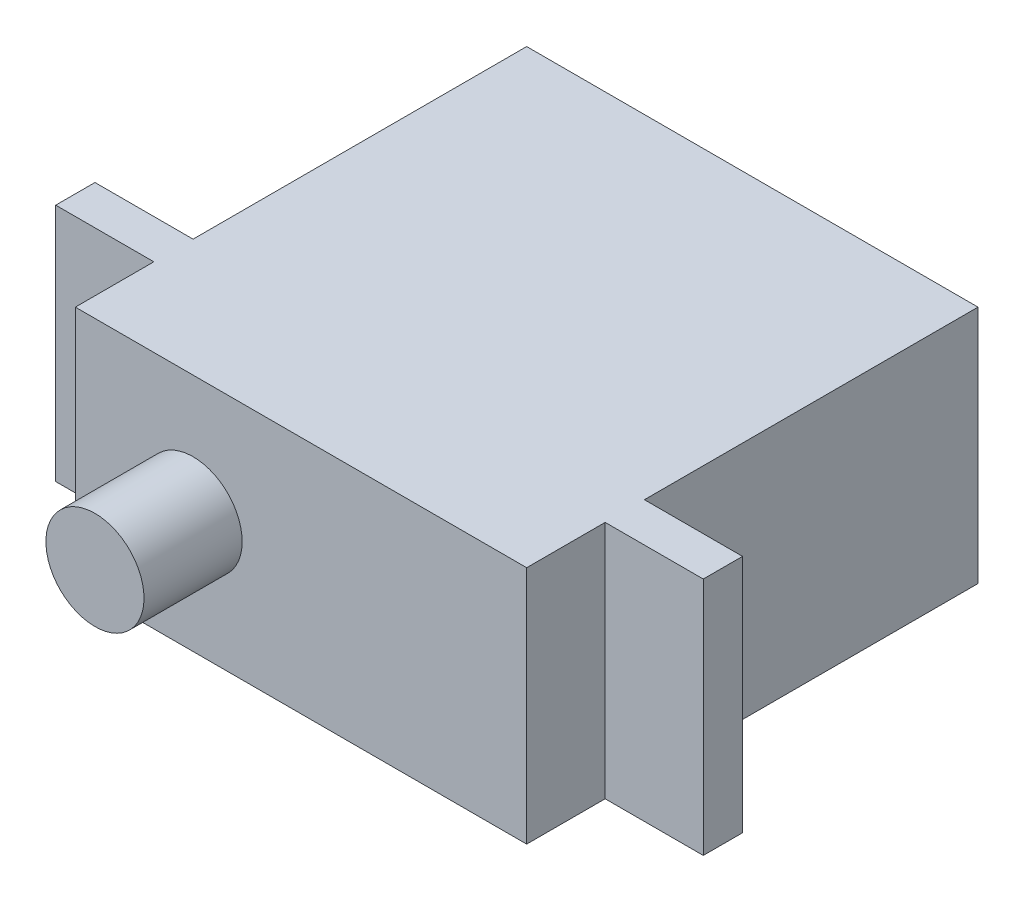
ISO-10303-21;
HEADER;
FILE_DESCRIPTION(('STEP AP214'),'2;1');
FILE_NAME('part.step','',(''),(''),'','','');
FILE_SCHEMA(('AUTOMOTIVE_DESIGN { 1 0 10303 214 1 1 1 1 }'));
ENDSEC;
DATA;
#1=APPLICATION_CONTEXT('core data for automotive mechanical design processes');
#2=APPLICATION_PROTOCOL_DEFINITION('international standard','automotive_design',2000,#1);
#3=PRODUCT_CONTEXT('',#1,'mechanical');
#4=PRODUCT('Part','Part','',(#3));
#5=PRODUCT_RELATED_PRODUCT_CATEGORY('part','',(#4));
#6=PRODUCT_DEFINITION_FORMATION('','',#4);
#7=PRODUCT_DEFINITION_CONTEXT('part definition',#1,'design');
#8=PRODUCT_DEFINITION('design','',#6,#7);
#9=PRODUCT_DEFINITION_SHAPE('','',#8);
#10=(LENGTH_UNIT() NAMED_UNIT(*) SI_UNIT(.MILLI.,.METRE.));
#11=(NAMED_UNIT(*) PLANE_ANGLE_UNIT() SI_UNIT($,.RADIAN.));
#12=(NAMED_UNIT(*) SI_UNIT($,.STERADIAN.) SOLID_ANGLE_UNIT());
#13=UNCERTAINTY_MEASURE_WITH_UNIT(LENGTH_MEASURE(1.E-05),#10,'distance_accuracy_value','');
#14=(GEOMETRIC_REPRESENTATION_CONTEXT(3) GLOBAL_UNCERTAINTY_ASSIGNED_CONTEXT((#13)) GLOBAL_UNIT_ASSIGNED_CONTEXT((#10,
#11,#12)) REPRESENTATION_CONTEXT('',''));
#15=CARTESIAN_POINT('',(0.,0.,0.));
#16=DIRECTION('',(0.,0.,1.));
#17=DIRECTION('',(1.,0.,0.));
#18=AXIS2_PLACEMENT_3D('',#15,#16,#17);
#19=CARTESIAN_POINT('',(-6.,-6.1,4.));
#20=DIRECTION('',(1.,0.,0.));
#21=DIRECTION('',(0.,0.,-1.));
#22=AXIS2_PLACEMENT_3D('',#19,#20,#21);
#23=PLANE('',#22);
#24=DIRECTION('',(0.,1.,0.));
#25=VECTOR('',#24,1.);
#26=CARTESIAN_POINT('',(-6.,-6.1,0.));
#27=LINE('',#26,#25);
#28=CARTESIAN_POINT('',(-6.,-6.1,0.));
#29=VERTEX_POINT('',#28);
#30=CARTESIAN_POINT('',(-6.,6.1,0.));
#31=VERTEX_POINT('',#30);
#32=EDGE_CURVE('E165',#29,#31,#27,.T.);
#33=ORIENTED_EDGE('',*,*,#32,.F.);
#34=DIRECTION('',(0.,0.,-1.));
#35=VECTOR('',#34,1.);
#36=CARTESIAN_POINT('',(-6.,-6.1,4.));
#37=LINE('',#36,#35);
#38=CARTESIAN_POINT('',(-6.,-6.1,4.));
#39=VERTEX_POINT('',#38);
#40=EDGE_CURVE('E143',#39,#29,#37,.T.);
#41=ORIENTED_EDGE('',*,*,#40,.F.);
#42=DIRECTION('',(0.,-1.,0.));
#43=VECTOR('',#42,1.);
#44=CARTESIAN_POINT('',(-6.,-6.1,4.));
#45=LINE('',#44,#43);
#46=CARTESIAN_POINT('',(-6.,6.1,4.));
#47=VERTEX_POINT('',#46);
#48=EDGE_CURVE('E172',#47,#39,#45,.T.);
#49=ORIENTED_EDGE('',*,*,#48,.F.);
#50=DIRECTION('',(0.,0.,-1.));
#51=VECTOR('',#50,1.);
#52=CARTESIAN_POINT('',(-6.,6.1,4.));
#53=LINE('',#52,#51);
#54=EDGE_CURVE('E195',#47,#31,#53,.T.);
#55=ORIENTED_EDGE('',*,*,#54,.T.);
#56=EDGE_LOOP('',(#33,#41,#49,#55));
#57=FACE_BOUND('',#56,.T.);
#58=ADVANCED_FACE('F43',(#57),#23,.F.);
#59=CARTESIAN_POINT('',(17.,-6.1,4.));
#60=DIRECTION('',(-1.,0.,0.));
#61=DIRECTION('',(0.,0.,1.));
#62=AXIS2_PLACEMENT_3D('',#59,#60,#61);
#63=PLANE('',#62);
#64=DIRECTION('',(0.,-1.,0.));
#65=VECTOR('',#64,1.);
#66=CARTESIAN_POINT('',(17.,-6.1,0.));
#67=LINE('',#66,#65);
#68=CARTESIAN_POINT('',(17.,6.1,0.));
#69=VERTEX_POINT('',#68);
#70=CARTESIAN_POINT('',(17.,-6.1,0.));
#71=VERTEX_POINT('',#70);
#72=EDGE_CURVE('E50',#69,#71,#67,.T.);
#73=ORIENTED_EDGE('',*,*,#72,.F.);
#74=DIRECTION('',(0.,0.,-1.));
#75=VECTOR('',#74,1.);
#76=CARTESIAN_POINT('',(17.,6.1,4.));
#77=LINE('',#76,#75);
#78=CARTESIAN_POINT('',(17.,6.1,4.));
#79=VERTEX_POINT('',#78);
#80=EDGE_CURVE('E198',#79,#69,#77,.T.);
#81=ORIENTED_EDGE('',*,*,#80,.F.);
#82=DIRECTION('',(0.,1.,0.));
#83=VECTOR('',#82,1.);
#84=CARTESIAN_POINT('',(17.,-6.1,4.));
#85=LINE('',#84,#83);
#86=CARTESIAN_POINT('',(17.,-6.1,4.));
#87=VERTEX_POINT('',#86);
#88=EDGE_CURVE('E179',#87,#79,#85,.T.);
#89=ORIENTED_EDGE('',*,*,#88,.F.);
#90=DIRECTION('',(0.,0.,-1.));
#91=VECTOR('',#90,1.);
#92=CARTESIAN_POINT('',(17.,-6.1,4.));
#93=LINE('',#92,#91);
#94=EDGE_CURVE('E199',#87,#71,#93,.T.);
#95=ORIENTED_EDGE('',*,*,#94,.T.);
#96=EDGE_LOOP('',(#73,#81,#89,#95));
#97=FACE_BOUND('',#96,.T.);
#98=ADVANCED_FACE('F219',(#97),#63,.F.);
#99=CARTESIAN_POINT('',(-6.,-6.1,-2.));
#100=VERTEX_POINT('',#99);
#101=CARTESIAN_POINT('',(-6.,-6.1,-19.));
#102=VERTEX_POINT('',#101);
#103=EDGE_CURVE('E201',#100,#102,#37,.T.);
#104=ORIENTED_EDGE('',*,*,#103,.F.);
#105=DIRECTION('',(0.,1.,0.));
#106=VECTOR('',#105,1.);
#107=CARTESIAN_POINT('',(-6.,-6.1,-2.));
#108=LINE('',#107,#106);
#109=CARTESIAN_POINT('',(-6.,6.1,-2.));
#110=VERTEX_POINT('',#109);
#111=EDGE_CURVE('E157',#100,#110,#108,.T.);
#112=ORIENTED_EDGE('',*,*,#111,.T.);
#113=CARTESIAN_POINT('',(-6.,6.1,-19.));
#114=VERTEX_POINT('',#113);
#115=EDGE_CURVE('E182',#110,#114,#53,.T.);
#116=ORIENTED_EDGE('',*,*,#115,.T.);
#117=DIRECTION('',(0.,-1.,0.));
#118=VECTOR('',#117,1.);
#119=CARTESIAN_POINT('',(-6.,-6.1,-19.));
#120=LINE('',#119,#118);
#121=EDGE_CURVE('E168',#114,#102,#120,.T.);
#122=ORIENTED_EDGE('',*,*,#121,.T.);
#123=EDGE_LOOP('',(#104,#112,#116,#122));
#124=FACE_BOUND('',#123,.T.);
#125=ADVANCED_FACE('F44',(#124),#23,.F.);
#126=CARTESIAN_POINT('',(-6.,-6.1,4.));
#127=DIRECTION('',(0.,1.,0.));
#128=DIRECTION('',(0.,0.,1.));
#129=AXIS2_PLACEMENT_3D('',#126,#127,#128);
#130=PLANE('',#129);
#131=ORIENTED_EDGE('',*,*,#40,.T.);
#132=DIRECTION('',(1.,0.,0.));
#133=VECTOR('',#132,1.);
#134=CARTESIAN_POINT('',(-11.,-6.1,0.));
#135=LINE('',#134,#133);
#136=CARTESIAN_POINT('',(-11.,-6.1,0.));
#137=VERTEX_POINT('',#136);
#138=EDGE_CURVE('E134',#137,#29,#135,.T.);
#139=ORIENTED_EDGE('',*,*,#138,.F.);
#140=DIRECTION('',(0.,0.,-1.));
#141=VECTOR('',#140,1.);
#142=CARTESIAN_POINT('',(-11.,-6.1,0.));
#143=LINE('',#142,#141);
#144=CARTESIAN_POINT('',(-11.,-6.1,-2.));
#145=VERTEX_POINT('',#144);
#146=EDGE_CURVE('E139',#137,#145,#143,.T.);
#147=ORIENTED_EDGE('',*,*,#146,.T.);
#148=DIRECTION('',(1.,0.,0.));
#149=VECTOR('',#148,1.);
#150=CARTESIAN_POINT('',(-11.,-6.1,-2.));
#151=LINE('',#150,#149);
#152=EDGE_CURVE('E231',#145,#100,#151,.T.);
#153=ORIENTED_EDGE('',*,*,#152,.T.);
#154=ORIENTED_EDGE('',*,*,#103,.T.);
#155=DIRECTION('',(1.,0.,0.));
#156=VECTOR('',#155,1.);
#157=CARTESIAN_POINT('',(-6.,-6.1,-19.));
#158=LINE('',#157,#156);
#159=CARTESIAN_POINT('',(17.,-6.1,-19.));
#160=VERTEX_POINT('',#159);
#161=EDGE_CURVE('E184',#102,#160,#158,.T.);
#162=ORIENTED_EDGE('',*,*,#161,.T.);
#163=CARTESIAN_POINT('',(17.,-6.1,-2.));
#164=VERTEX_POINT('',#163);
#165=EDGE_CURVE('E200',#164,#160,#93,.T.);
#166=ORIENTED_EDGE('',*,*,#165,.F.);
#167=CARTESIAN_POINT('',(22.,-6.1,-2.));
#168=VERTEX_POINT('',#167);
#169=EDGE_CURVE('E69',#164,#168,#151,.T.);
#170=ORIENTED_EDGE('',*,*,#169,.T.);
#171=DIRECTION('',(0.,0.,-1.));
#172=VECTOR('',#171,1.);
#173=CARTESIAN_POINT('',(22.,-6.1,0.));
#174=LINE('',#173,#172);
#175=CARTESIAN_POINT('',(22.,-6.1,0.));
#176=VERTEX_POINT('',#175);
#177=EDGE_CURVE('E159',#176,#168,#174,.T.);
#178=ORIENTED_EDGE('',*,*,#177,.F.);
#179=EDGE_CURVE('E144',#71,#176,#135,.T.);
#180=ORIENTED_EDGE('',*,*,#179,.F.);
#181=ORIENTED_EDGE('',*,*,#94,.F.);
#182=DIRECTION('',(1.,0.,0.));
#183=VECTOR('',#182,1.);
#184=CARTESIAN_POINT('',(-6.,-6.1,4.));
#185=LINE('',#184,#183);
#186=EDGE_CURVE('E171',#39,#87,#185,.T.);
#187=ORIENTED_EDGE('',*,*,#186,.F.);
#188=EDGE_LOOP('',(#131,#139,#147,#153,#154,#162,#166,#170,#178,#180,#181,#187));
#189=FACE_BOUND('',#188,.T.);
#190=ADVANCED_FACE('F133',(#189),#130,.F.);
#191=CARTESIAN_POINT('',(17.,6.1,-2.));
#192=VERTEX_POINT('',#191);
#193=CARTESIAN_POINT('',(17.,6.1,-19.));
#194=VERTEX_POINT('',#193);
#195=EDGE_CURVE('E193',#192,#194,#77,.T.);
#196=ORIENTED_EDGE('',*,*,#195,.F.);
#197=DIRECTION('',(0.,-1.,0.));
#198=VECTOR('',#197,1.);
#199=CARTESIAN_POINT('',(17.,-6.1,-2.));
#200=LINE('',#199,#198);
#201=EDGE_CURVE('E204',#192,#164,#200,.T.);
#202=ORIENTED_EDGE('',*,*,#201,.T.);
#203=ORIENTED_EDGE('',*,*,#165,.T.);
#204=DIRECTION('',(0.,1.,0.));
#205=VECTOR('',#204,1.);
#206=CARTESIAN_POINT('',(17.,-6.1,-19.));
#207=LINE('',#206,#205);
#208=EDGE_CURVE('E190',#160,#194,#207,.T.);
#209=ORIENTED_EDGE('',*,*,#208,.T.);
#210=EDGE_LOOP('',(#196,#202,#203,#209));
#211=FACE_BOUND('',#210,.T.);
#212=ADVANCED_FACE('F264',(#211),#63,.F.);
#213=CARTESIAN_POINT('',(-6.,6.1,4.));
#214=DIRECTION('',(0.,-1.,0.));
#215=DIRECTION('',(0.,0.,-1.));
#216=AXIS2_PLACEMENT_3D('',#213,#214,#215);
#217=PLANE('',#216);
#218=ORIENTED_EDGE('',*,*,#80,.T.);
#219=DIRECTION('',(-1.,0.,0.));
#220=VECTOR('',#219,1.);
#221=CARTESIAN_POINT('',(-11.,6.1,0.));
#222=LINE('',#221,#220);
#223=CARTESIAN_POINT('',(22.,6.1,0.));
#224=VERTEX_POINT('',#223);
#225=EDGE_CURVE('E212',#224,#69,#222,.T.);
#226=ORIENTED_EDGE('',*,*,#225,.F.);
#227=DIRECTION('',(0.,0.,-1.));
#228=VECTOR('',#227,1.);
#229=CARTESIAN_POINT('',(22.,6.1,0.));
#230=LINE('',#229,#228);
#231=CARTESIAN_POINT('',(22.,6.1,-2.));
#232=VERTEX_POINT('',#231);
#233=EDGE_CURVE('E164',#224,#232,#230,.T.);
#234=ORIENTED_EDGE('',*,*,#233,.T.);
#235=DIRECTION('',(-1.,0.,0.));
#236=VECTOR('',#235,1.);
#237=CARTESIAN_POINT('',(-11.,6.1,-2.));
#238=LINE('',#237,#236);
#239=EDGE_CURVE('E154',#232,#192,#238,.T.);
#240=ORIENTED_EDGE('',*,*,#239,.T.);
#241=ORIENTED_EDGE('',*,*,#195,.T.);
#242=DIRECTION('',(-1.,0.,0.));
#243=VECTOR('',#242,1.);
#244=CARTESIAN_POINT('',(-6.,6.1,-19.));
#245=LINE('',#244,#243);
#246=EDGE_CURVE('E173',#194,#114,#245,.T.);
#247=ORIENTED_EDGE('',*,*,#246,.T.);
#248=ORIENTED_EDGE('',*,*,#115,.F.);
#249=CARTESIAN_POINT('',(-11.,6.1,-2.));
#250=VERTEX_POINT('',#249);
#251=EDGE_CURVE('E56',#110,#250,#238,.T.);
#252=ORIENTED_EDGE('',*,*,#251,.T.);
#253=DIRECTION('',(0.,0.,-1.));
#254=VECTOR('',#253,1.);
#255=CARTESIAN_POINT('',(-11.,6.1,0.));
#256=LINE('',#255,#254);
#257=CARTESIAN_POINT('',(-11.,6.1,0.));
#258=VERTEX_POINT('',#257);
#259=EDGE_CURVE('E226',#258,#250,#256,.T.);
#260=ORIENTED_EDGE('',*,*,#259,.F.);
#261=EDGE_CURVE('E151',#31,#258,#222,.T.);
#262=ORIENTED_EDGE('',*,*,#261,.F.);
#263=ORIENTED_EDGE('',*,*,#54,.F.);
#264=DIRECTION('',(-1.,0.,0.));
#265=VECTOR('',#264,1.);
#266=CARTESIAN_POINT('',(-6.,6.1,4.));
#267=LINE('',#266,#265);
#268=EDGE_CURVE('E180',#79,#47,#267,.T.);
#269=ORIENTED_EDGE('',*,*,#268,.F.);
#270=EDGE_LOOP('',(#218,#226,#234,#240,#241,#247,#248,#252,#260,#262,#263,#269));
#271=FACE_BOUND('',#270,.T.);
#272=ADVANCED_FACE('F229',(#271),#217,.F.);
#273=CARTESIAN_POINT('',(0.,0.,4.));
#274=DIRECTION('',(0.,0.,-1.));
#275=DIRECTION('',(-1.,0.,0.));
#276=AXIS2_PLACEMENT_3D('',#273,#274,#275);
#277=PLANE('',#276);
#278=CARTESIAN_POINT('',(0.,0.,4.));
#279=DIRECTION('',(0.,0.,1.));
#280=DIRECTION('',(1.,0.,0.));
#281=AXIS2_PLACEMENT_3D('',#278,#279,#280);
#282=CIRCLE('',#281,2.5);
#283=CARTESIAN_POINT('',(2.5,0.,4.));
#284=VERTEX_POINT('',#283);
#285=EDGE_CURVE('E11',#284,#284,#282,.T.);
#286=ORIENTED_EDGE('',*,*,#285,.F.);
#287=EDGE_LOOP('',(#286));
#288=FACE_BOUND('',#287,.T.);
#289=ORIENTED_EDGE('',*,*,#48,.T.);
#290=ORIENTED_EDGE('',*,*,#186,.T.);
#291=ORIENTED_EDGE('',*,*,#88,.T.);
#292=ORIENTED_EDGE('',*,*,#268,.T.);
#293=EDGE_LOOP('',(#289,#290,#291,#292));
#294=FACE_BOUND('',#293,.T.);
#295=ADVANCED_FACE('F224',(#288,#294),#277,.F.);
#296=CARTESIAN_POINT('',(0.,0.,-19.));
#297=DIRECTION('',(0.,0.,-1.));
#298=DIRECTION('',(-1.,0.,0.));
#299=AXIS2_PLACEMENT_3D('',#296,#297,#298);
#300=PLANE('',#299);
#301=ORIENTED_EDGE('',*,*,#121,.F.);
#302=ORIENTED_EDGE('',*,*,#246,.F.);
#303=ORIENTED_EDGE('',*,*,#208,.F.);
#304=ORIENTED_EDGE('',*,*,#161,.F.);
#305=EDGE_LOOP('',(#301,#302,#303,#304));
#306=FACE_BOUND('',#305,.T.);
#307=ADVANCED_FACE('F249',(#306),#300,.T.);
#308=CARTESIAN_POINT('',(22.,-6.1,0.));
#309=DIRECTION('',(-1.,0.,0.));
#310=DIRECTION('',(0.,0.,1.));
#311=AXIS2_PLACEMENT_3D('',#308,#309,#310);
#312=PLANE('',#311);
#313=DIRECTION('',(0.,1.,0.));
#314=VECTOR('',#313,1.);
#315=CARTESIAN_POINT('',(22.,-6.1,-2.));
#316=LINE('',#315,#314);
#317=EDGE_CURVE('E240',#168,#232,#316,.T.);
#318=ORIENTED_EDGE('',*,*,#317,.T.);
#319=ORIENTED_EDGE('',*,*,#233,.F.);
#320=DIRECTION('',(0.,1.,0.));
#321=VECTOR('',#320,1.);
#322=CARTESIAN_POINT('',(22.,-6.1,0.));
#323=LINE('',#322,#321);
#324=EDGE_CURVE('E145',#176,#224,#323,.T.);
#325=ORIENTED_EDGE('',*,*,#324,.F.);
#326=ORIENTED_EDGE('',*,*,#177,.T.);
#327=EDGE_LOOP('',(#318,#319,#325,#326));
#328=FACE_BOUND('',#327,.T.);
#329=ADVANCED_FACE('F247',(#328),#312,.F.);
#330=CARTESIAN_POINT('',(0.,0.,-2.));
#331=DIRECTION('',(0.,0.,-1.));
#332=DIRECTION('',(-1.,0.,0.));
#333=AXIS2_PLACEMENT_3D('',#330,#331,#332);
#334=PLANE('',#333);
#335=ORIENTED_EDGE('',*,*,#201,.F.);
#336=ORIENTED_EDGE('',*,*,#239,.F.);
#337=ORIENTED_EDGE('',*,*,#317,.F.);
#338=ORIENTED_EDGE('',*,*,#169,.F.);
#339=EDGE_LOOP('',(#335,#336,#337,#338));
#340=FACE_BOUND('',#339,.T.);
#341=ADVANCED_FACE('F243',(#340),#334,.T.);
#342=CARTESIAN_POINT('',(0.,0.,0.));
#343=DIRECTION('',(0.,0.,-1.));
#344=DIRECTION('',(-1.,0.,0.));
#345=AXIS2_PLACEMENT_3D('',#342,#343,#344);
#346=PLANE('',#345);
#347=ORIENTED_EDGE('',*,*,#225,.T.);
#348=ORIENTED_EDGE('',*,*,#72,.T.);
#349=ORIENTED_EDGE('',*,*,#179,.T.);
#350=ORIENTED_EDGE('',*,*,#324,.T.);
#351=EDGE_LOOP('',(#347,#348,#349,#350));
#352=FACE_BOUND('',#351,.T.);
#353=ADVANCED_FACE('F211',(#352),#346,.F.);
#354=ORIENTED_EDGE('',*,*,#138,.T.);
#355=ORIENTED_EDGE('',*,*,#32,.T.);
#356=ORIENTED_EDGE('',*,*,#261,.T.);
#357=DIRECTION('',(0.,-1.,0.));
#358=VECTOR('',#357,1.);
#359=CARTESIAN_POINT('',(-11.,-6.1,0.));
#360=LINE('',#359,#358);
#361=EDGE_CURVE('E146',#258,#137,#360,.T.);
#362=ORIENTED_EDGE('',*,*,#361,.T.);
#363=EDGE_LOOP('',(#354,#355,#356,#362));
#364=FACE_BOUND('',#363,.T.);
#365=ADVANCED_FACE('F149',(#364),#346,.F.);
#366=ORIENTED_EDGE('',*,*,#111,.F.);
#367=ORIENTED_EDGE('',*,*,#152,.F.);
#368=DIRECTION('',(0.,-1.,0.));
#369=VECTOR('',#368,1.);
#370=CARTESIAN_POINT('',(-11.,-6.1,-2.));
#371=LINE('',#370,#369);
#372=EDGE_CURVE('E158',#250,#145,#371,.T.);
#373=ORIENTED_EDGE('',*,*,#372,.F.);
#374=ORIENTED_EDGE('',*,*,#251,.F.);
#375=EDGE_LOOP('',(#366,#367,#373,#374));
#376=FACE_BOUND('',#375,.T.);
#377=ADVANCED_FACE('F254',(#376),#334,.T.);
#378=CARTESIAN_POINT('',(-11.,-6.1,0.));
#379=DIRECTION('',(1.,0.,0.));
#380=DIRECTION('',(0.,0.,-1.));
#381=AXIS2_PLACEMENT_3D('',#378,#379,#380);
#382=PLANE('',#381);
#383=ORIENTED_EDGE('',*,*,#372,.T.);
#384=ORIENTED_EDGE('',*,*,#146,.F.);
#385=ORIENTED_EDGE('',*,*,#361,.F.);
#386=ORIENTED_EDGE('',*,*,#259,.T.);
#387=EDGE_LOOP('',(#383,#384,#385,#386));
#388=FACE_BOUND('',#387,.T.);
#389=ADVANCED_FACE('F160',(#388),#382,.F.);
#390=CARTESIAN_POINT('',(0.,0.,9.));
#391=DIRECTION('',(0.,0.,-1.));
#392=DIRECTION('',(-1.,0.,0.));
#393=AXIS2_PLACEMENT_3D('',#390,#391,#392);
#394=CYLINDRICAL_SURFACE('',#393,2.5);
#395=CARTESIAN_POINT('',(0.,0.,9.));
#396=DIRECTION('',(0.,0.,1.));
#397=DIRECTION('',(1.,0.,0.));
#398=AXIS2_PLACEMENT_3D('',#395,#396,#397);
#399=CIRCLE('',#398,2.5);
#400=CARTESIAN_POINT('',(2.5,0.,9.));
#401=VERTEX_POINT('',#400);
#402=EDGE_CURVE('E235',#401,#401,#399,.T.);
#403=ORIENTED_EDGE('',*,*,#402,.F.);
#404=EDGE_LOOP('',(#403));
#405=FACE_BOUND('',#404,.T.);
#406=ORIENTED_EDGE('',*,*,#285,.T.);
#407=EDGE_LOOP('',(#406));
#408=FACE_BOUND('',#407,.T.);
#409=ADVANCED_FACE('F285',(#405,#408),#394,.T.);
#410=CARTESIAN_POINT('',(0.,0.,9.));
#411=DIRECTION('',(0.,0.,1.));
#412=DIRECTION('',(1.,0.,0.));
#413=AXIS2_PLACEMENT_3D('',#410,#411,#412);
#414=PLANE('',#413);
#415=ORIENTED_EDGE('',*,*,#402,.T.);
#416=EDGE_LOOP('',(#415));
#417=FACE_BOUND('',#416,.T.);
#418=ADVANCED_FACE('F289',(#417),#414,.T.);
#419=CLOSED_SHELL('',(#58,#98,#125,#190,#212,#272,#295,#307,#329,#341,#353,#365,#377,#389,#409,#418));
#420=MANIFOLD_SOLID_BREP('B2',#419);
#421=ADVANCED_BREP_SHAPE_REPRESENTATION('',(#18,#420),#14);
#422=SHAPE_DEFINITION_REPRESENTATION(#9,#421);
ENDSEC;
END-ISO-10303-21;
